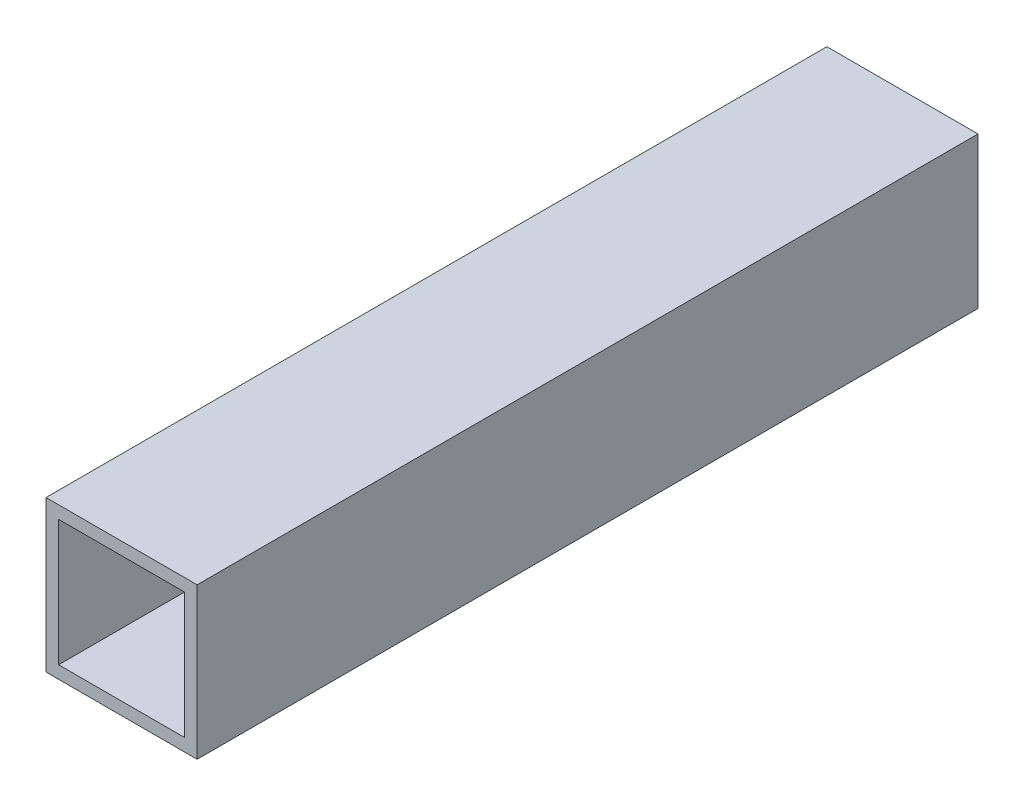
ISO-10303-21;
HEADER;
FILE_DESCRIPTION(('STEP AP214'),'2;1');
FILE_NAME('part.step','',(''),(''),'','','');
FILE_SCHEMA(('AUTOMOTIVE_DESIGN { 1 0 10303 214 1 1 1 1 }'));
ENDSEC;
DATA;
#1=APPLICATION_CONTEXT('core data for automotive mechanical design processes');
#2=APPLICATION_PROTOCOL_DEFINITION('international standard','automotive_design',2000,#1);
#3=PRODUCT_CONTEXT('',#1,'mechanical');
#4=PRODUCT('Part','Part','',(#3));
#5=PRODUCT_RELATED_PRODUCT_CATEGORY('part','',(#4));
#6=PRODUCT_DEFINITION_FORMATION('','',#4);
#7=PRODUCT_DEFINITION_CONTEXT('part definition',#1,'design');
#8=PRODUCT_DEFINITION('design','',#6,#7);
#9=PRODUCT_DEFINITION_SHAPE('','',#8);
#10=(LENGTH_UNIT() NAMED_UNIT(*) SI_UNIT(.MILLI.,.METRE.));
#11=(NAMED_UNIT(*) PLANE_ANGLE_UNIT() SI_UNIT($,.RADIAN.));
#12=(NAMED_UNIT(*) SI_UNIT($,.STERADIAN.) SOLID_ANGLE_UNIT());
#13=UNCERTAINTY_MEASURE_WITH_UNIT(LENGTH_MEASURE(1.E-05),#10,'distance_accuracy_value','');
#14=(GEOMETRIC_REPRESENTATION_CONTEXT(3) GLOBAL_UNCERTAINTY_ASSIGNED_CONTEXT((#13)) GLOBAL_UNIT_ASSIGNED_CONTEXT((#10,
#11,#12)) REPRESENTATION_CONTEXT('',''));
#15=CARTESIAN_POINT('',(0.,0.,0.));
#16=DIRECTION('',(0.,0.,1.));
#17=DIRECTION('',(1.,0.,0.));
#18=AXIS2_PLACEMENT_3D('',#15,#16,#17);
#19=CARTESIAN_POINT('',(0.,0.,62.));
#20=DIRECTION('',(0.,0.,1.));
#21=DIRECTION('',(1.,0.,0.));
#22=AXIS2_PLACEMENT_3D('',#19,#20,#21);
#23=PLANE('',#22);
#24=DIRECTION('',(0.,-1.,0.));
#25=VECTOR('',#24,1.);
#26=CARTESIAN_POINT('',(-12.,12.,62.));
#27=LINE('',#26,#25);
#28=CARTESIAN_POINT('',(-12.,12.,62.));
#29=VERTEX_POINT('',#28);
#30=CARTESIAN_POINT('',(-12.,-12.,62.));
#31=VERTEX_POINT('',#30);
#32=EDGE_CURVE('E136',#29,#31,#27,.T.);
#33=ORIENTED_EDGE('',*,*,#32,.T.);
#34=DIRECTION('',(1.,0.,0.));
#35=VECTOR('',#34,1.);
#36=CARTESIAN_POINT('',(-12.,-12.,62.));
#37=LINE('',#36,#35);
#38=CARTESIAN_POINT('',(12.,-12.,62.));
#39=VERTEX_POINT('',#38);
#40=EDGE_CURVE('E139',#31,#39,#37,.T.);
#41=ORIENTED_EDGE('',*,*,#40,.T.);
#42=DIRECTION('',(0.,1.,0.));
#43=VECTOR('',#42,1.);
#44=CARTESIAN_POINT('',(12.,12.,62.));
#45=LINE('',#44,#43);
#46=CARTESIAN_POINT('',(12.,12.,62.));
#47=VERTEX_POINT('',#46);
#48=EDGE_CURVE('E142',#39,#47,#45,.T.);
#49=ORIENTED_EDGE('',*,*,#48,.T.);
#50=DIRECTION('',(-1.,0.,0.));
#51=VECTOR('',#50,1.);
#52=CARTESIAN_POINT('',(-12.,12.,62.));
#53=LINE('',#52,#51);
#54=EDGE_CURVE('E144',#47,#29,#53,.T.);
#55=ORIENTED_EDGE('',*,*,#54,.T.);
#56=EDGE_LOOP('',(#33,#41,#49,#55));
#57=FACE_BOUND('',#56,.T.);
#58=DIRECTION('',(-1.,0.,0.));
#59=VECTOR('',#58,1.);
#60=CARTESIAN_POINT('',(-10.,10.,62.));
#61=LINE('',#60,#59);
#62=CARTESIAN_POINT('',(10.,10.,62.));
#63=VERTEX_POINT('',#62);
#64=CARTESIAN_POINT('',(-10.,10.,62.));
#65=VERTEX_POINT('',#64);
#66=EDGE_CURVE('E108',#63,#65,#61,.T.);
#67=ORIENTED_EDGE('',*,*,#66,.F.);
#68=DIRECTION('',(0.,1.,0.));
#69=VECTOR('',#68,1.);
#70=CARTESIAN_POINT('',(10.,10.,62.));
#71=LINE('',#70,#69);
#72=CARTESIAN_POINT('',(10.,-10.,62.));
#73=VERTEX_POINT('',#72);
#74=EDGE_CURVE('E100',#73,#63,#71,.T.);
#75=ORIENTED_EDGE('',*,*,#74,.F.);
#76=DIRECTION('',(1.,0.,0.));
#77=VECTOR('',#76,1.);
#78=CARTESIAN_POINT('',(-10.,-10.,62.));
#79=LINE('',#78,#77);
#80=CARTESIAN_POINT('',(-10.,-10.,62.));
#81=VERTEX_POINT('',#80);
#82=EDGE_CURVE('E122',#81,#73,#79,.T.);
#83=ORIENTED_EDGE('',*,*,#82,.F.);
#84=DIRECTION('',(0.,-1.,0.));
#85=VECTOR('',#84,1.);
#86=CARTESIAN_POINT('',(-10.,10.,62.));
#87=LINE('',#86,#85);
#88=EDGE_CURVE('E120',#65,#81,#87,.T.);
#89=ORIENTED_EDGE('',*,*,#88,.F.);
#90=EDGE_LOOP('',(#67,#75,#83,#89));
#91=FACE_BOUND('',#90,.T.);
#92=ADVANCED_FACE('F35',(#57,#91),#23,.T.);
#93=CARTESIAN_POINT('',(0.,0.,-62.));
#94=DIRECTION('',(0.,0.,1.));
#95=DIRECTION('',(1.,0.,0.));
#96=AXIS2_PLACEMENT_3D('',#93,#94,#95);
#97=PLANE('',#96);
#98=DIRECTION('',(0.,-1.,0.));
#99=VECTOR('',#98,1.);
#100=CARTESIAN_POINT('',(-12.,12.,-62.));
#101=LINE('',#100,#99);
#102=CARTESIAN_POINT('',(-12.,12.,-62.));
#103=VERTEX_POINT('',#102);
#104=CARTESIAN_POINT('',(-12.,-12.,-62.));
#105=VERTEX_POINT('',#104);
#106=EDGE_CURVE('E116',#103,#105,#101,.T.);
#107=ORIENTED_EDGE('',*,*,#106,.F.);
#108=DIRECTION('',(-1.,0.,0.));
#109=VECTOR('',#108,1.);
#110=CARTESIAN_POINT('',(-12.,12.,-62.));
#111=LINE('',#110,#109);
#112=CARTESIAN_POINT('',(12.,12.,-62.));
#113=VERTEX_POINT('',#112);
#114=EDGE_CURVE('E140',#113,#103,#111,.T.);
#115=ORIENTED_EDGE('',*,*,#114,.F.);
#116=DIRECTION('',(0.,1.,0.));
#117=VECTOR('',#116,1.);
#118=CARTESIAN_POINT('',(12.,12.,-62.));
#119=LINE('',#118,#117);
#120=CARTESIAN_POINT('',(12.,-12.,-62.));
#121=VERTEX_POINT('',#120);
#122=EDGE_CURVE('E151',#121,#113,#119,.T.);
#123=ORIENTED_EDGE('',*,*,#122,.F.);
#124=DIRECTION('',(1.,0.,0.));
#125=VECTOR('',#124,1.);
#126=CARTESIAN_POINT('',(-12.,-12.,-62.));
#127=LINE('',#126,#125);
#128=EDGE_CURVE('E149',#105,#121,#127,.T.);
#129=ORIENTED_EDGE('',*,*,#128,.F.);
#130=EDGE_LOOP('',(#107,#115,#123,#129));
#131=FACE_BOUND('',#130,.T.);
#132=DIRECTION('',(0.,1.,0.));
#133=VECTOR('',#132,1.);
#134=CARTESIAN_POINT('',(10.,10.,-62.));
#135=LINE('',#134,#133);
#136=CARTESIAN_POINT('',(10.,-10.,-62.));
#137=VERTEX_POINT('',#136);
#138=CARTESIAN_POINT('',(10.,10.,-62.));
#139=VERTEX_POINT('',#138);
#140=EDGE_CURVE('E58',#137,#139,#135,.T.);
#141=ORIENTED_EDGE('',*,*,#140,.T.);
#142=DIRECTION('',(-1.,0.,0.));
#143=VECTOR('',#142,1.);
#144=CARTESIAN_POINT('',(-10.,10.,-62.));
#145=LINE('',#144,#143);
#146=CARTESIAN_POINT('',(-10.,10.,-62.));
#147=VERTEX_POINT('',#146);
#148=EDGE_CURVE('E115',#139,#147,#145,.T.);
#149=ORIENTED_EDGE('',*,*,#148,.T.);
#150=DIRECTION('',(0.,-1.,0.));
#151=VECTOR('',#150,1.);
#152=CARTESIAN_POINT('',(-10.,10.,-62.));
#153=LINE('',#152,#151);
#154=CARTESIAN_POINT('',(-10.,-10.,-62.));
#155=VERTEX_POINT('',#154);
#156=EDGE_CURVE('E128',#147,#155,#153,.T.);
#157=ORIENTED_EDGE('',*,*,#156,.T.);
#158=DIRECTION('',(1.,0.,0.));
#159=VECTOR('',#158,1.);
#160=CARTESIAN_POINT('',(-10.,-10.,-62.));
#161=LINE('',#160,#159);
#162=EDGE_CURVE('E109',#155,#137,#161,.T.);
#163=ORIENTED_EDGE('',*,*,#162,.T.);
#164=EDGE_LOOP('',(#141,#149,#157,#163));
#165=FACE_BOUND('',#164,.T.);
#166=ADVANCED_FACE('F169',(#131,#165),#97,.F.);
#167=CARTESIAN_POINT('',(-12.,12.,62.));
#168=DIRECTION('',(1.,0.,0.));
#169=DIRECTION('',(0.,1.,0.));
#170=AXIS2_PLACEMENT_3D('',#167,#168,#169);
#171=PLANE('',#170);
#172=ORIENTED_EDGE('',*,*,#106,.T.);
#173=DIRECTION('',(0.,0.,-1.));
#174=VECTOR('',#173,1.);
#175=CARTESIAN_POINT('',(-12.,-12.,62.));
#176=LINE('',#175,#174);
#177=EDGE_CURVE('E11',#31,#105,#176,.T.);
#178=ORIENTED_EDGE('',*,*,#177,.F.);
#179=ORIENTED_EDGE('',*,*,#32,.F.);
#180=DIRECTION('',(0.,0.,-1.));
#181=VECTOR('',#180,1.);
#182=CARTESIAN_POINT('',(-12.,12.,62.));
#183=LINE('',#182,#181);
#184=EDGE_CURVE('E146',#29,#103,#183,.T.);
#185=ORIENTED_EDGE('',*,*,#184,.T.);
#186=EDGE_LOOP('',(#172,#178,#179,#185));
#187=FACE_BOUND('',#186,.T.);
#188=ADVANCED_FACE('F37',(#187),#171,.F.);
#189=CARTESIAN_POINT('',(-12.,-12.,62.));
#190=DIRECTION('',(0.,1.,0.));
#191=DIRECTION('',(-1.,0.,0.));
#192=AXIS2_PLACEMENT_3D('',#189,#190,#191);
#193=PLANE('',#192);
#194=ORIENTED_EDGE('',*,*,#128,.T.);
#195=DIRECTION('',(0.,0.,-1.));
#196=VECTOR('',#195,1.);
#197=CARTESIAN_POINT('',(12.,-12.,62.));
#198=LINE('',#197,#196);
#199=EDGE_CURVE('E43',#39,#121,#198,.T.);
#200=ORIENTED_EDGE('',*,*,#199,.F.);
#201=ORIENTED_EDGE('',*,*,#40,.F.);
#202=ORIENTED_EDGE('',*,*,#177,.T.);
#203=EDGE_LOOP('',(#194,#200,#201,#202));
#204=FACE_BOUND('',#203,.T.);
#205=ADVANCED_FACE('F179',(#204),#193,.F.);
#206=CARTESIAN_POINT('',(12.,12.,62.));
#207=DIRECTION('',(-1.,0.,0.));
#208=DIRECTION('',(0.,-1.,0.));
#209=AXIS2_PLACEMENT_3D('',#206,#207,#208);
#210=PLANE('',#209);
#211=ORIENTED_EDGE('',*,*,#122,.T.);
#212=DIRECTION('',(0.,0.,-1.));
#213=VECTOR('',#212,1.);
#214=CARTESIAN_POINT('',(12.,12.,62.));
#215=LINE('',#214,#213);
#216=EDGE_CURVE('E156',#47,#113,#215,.T.);
#217=ORIENTED_EDGE('',*,*,#216,.F.);
#218=ORIENTED_EDGE('',*,*,#48,.F.);
#219=ORIENTED_EDGE('',*,*,#199,.T.);
#220=EDGE_LOOP('',(#211,#217,#218,#219));
#221=FACE_BOUND('',#220,.T.);
#222=ADVANCED_FACE('F163',(#221),#210,.F.);
#223=CARTESIAN_POINT('',(-12.,12.,62.));
#224=DIRECTION('',(0.,-1.,0.));
#225=DIRECTION('',(0.,0.,-1.));
#226=AXIS2_PLACEMENT_3D('',#223,#224,#225);
#227=PLANE('',#226);
#228=ORIENTED_EDGE('',*,*,#114,.T.);
#229=ORIENTED_EDGE('',*,*,#184,.F.);
#230=ORIENTED_EDGE('',*,*,#54,.F.);
#231=ORIENTED_EDGE('',*,*,#216,.T.);
#232=EDGE_LOOP('',(#228,#229,#230,#231));
#233=FACE_BOUND('',#232,.T.);
#234=ADVANCED_FACE('F173',(#233),#227,.F.);
#235=CARTESIAN_POINT('',(10.,10.,62.));
#236=DIRECTION('',(-1.,0.,0.));
#237=DIRECTION('',(0.,0.,1.));
#238=AXIS2_PLACEMENT_3D('',#235,#236,#237);
#239=PLANE('',#238);
#240=ORIENTED_EDGE('',*,*,#140,.F.);
#241=DIRECTION('',(0.,0.,-1.));
#242=VECTOR('',#241,1.);
#243=CARTESIAN_POINT('',(10.,-10.,62.));
#244=LINE('',#243,#242);
#245=EDGE_CURVE('E104',#73,#137,#244,.T.);
#246=ORIENTED_EDGE('',*,*,#245,.F.);
#247=ORIENTED_EDGE('',*,*,#74,.T.);
#248=DIRECTION('',(0.,0.,-1.));
#249=VECTOR('',#248,1.);
#250=CARTESIAN_POINT('',(10.,10.,62.));
#251=LINE('',#250,#249);
#252=EDGE_CURVE('E103',#63,#139,#251,.T.);
#253=ORIENTED_EDGE('',*,*,#252,.T.);
#254=EDGE_LOOP('',(#240,#246,#247,#253));
#255=FACE_BOUND('',#254,.T.);
#256=ADVANCED_FACE('F102',(#255),#239,.T.);
#257=CARTESIAN_POINT('',(-10.,10.,62.));
#258=DIRECTION('',(0.,-1.,0.));
#259=DIRECTION('',(0.,0.,-1.));
#260=AXIS2_PLACEMENT_3D('',#257,#258,#259);
#261=PLANE('',#260);
#262=ORIENTED_EDGE('',*,*,#148,.F.);
#263=ORIENTED_EDGE('',*,*,#252,.F.);
#264=ORIENTED_EDGE('',*,*,#66,.T.);
#265=DIRECTION('',(0.,0.,-1.));
#266=VECTOR('',#265,1.);
#267=CARTESIAN_POINT('',(-10.,10.,62.));
#268=LINE('',#267,#266);
#269=EDGE_CURVE('E117',#65,#147,#268,.T.);
#270=ORIENTED_EDGE('',*,*,#269,.T.);
#271=EDGE_LOOP('',(#262,#263,#264,#270));
#272=FACE_BOUND('',#271,.T.);
#273=ADVANCED_FACE('F112',(#272),#261,.T.);
#274=CARTESIAN_POINT('',(-10.,10.,62.));
#275=DIRECTION('',(1.,0.,0.));
#276=DIRECTION('',(0.,1.,0.));
#277=AXIS2_PLACEMENT_3D('',#274,#275,#276);
#278=PLANE('',#277);
#279=ORIENTED_EDGE('',*,*,#156,.F.);
#280=ORIENTED_EDGE('',*,*,#269,.F.);
#281=ORIENTED_EDGE('',*,*,#88,.T.);
#282=DIRECTION('',(0.,0.,-1.));
#283=VECTOR('',#282,1.);
#284=CARTESIAN_POINT('',(-10.,-10.,62.));
#285=LINE('',#284,#283);
#286=EDGE_CURVE('E50',#81,#155,#285,.T.);
#287=ORIENTED_EDGE('',*,*,#286,.T.);
#288=EDGE_LOOP('',(#279,#280,#281,#287));
#289=FACE_BOUND('',#288,.T.);
#290=ADVANCED_FACE('F202',(#289),#278,.T.);
#291=CARTESIAN_POINT('',(-10.,-10.,62.));
#292=DIRECTION('',(0.,1.,0.));
#293=DIRECTION('',(0.,0.,1.));
#294=AXIS2_PLACEMENT_3D('',#291,#292,#293);
#295=PLANE('',#294);
#296=ORIENTED_EDGE('',*,*,#162,.F.);
#297=ORIENTED_EDGE('',*,*,#286,.F.);
#298=ORIENTED_EDGE('',*,*,#82,.T.);
#299=ORIENTED_EDGE('',*,*,#245,.T.);
#300=EDGE_LOOP('',(#296,#297,#298,#299));
#301=FACE_BOUND('',#300,.T.);
#302=ADVANCED_FACE('F206',(#301),#295,.T.);
#303=CLOSED_SHELL('',(#92,#166,#188,#205,#222,#234,#256,#273,#290,#302));
#304=MANIFOLD_SOLID_BREP('B2',#303);
#305=ADVANCED_BREP_SHAPE_REPRESENTATION('',(#18,#304),#14);
#306=SHAPE_DEFINITION_REPRESENTATION(#9,#305);
ENDSEC;
END-ISO-10303-21;
